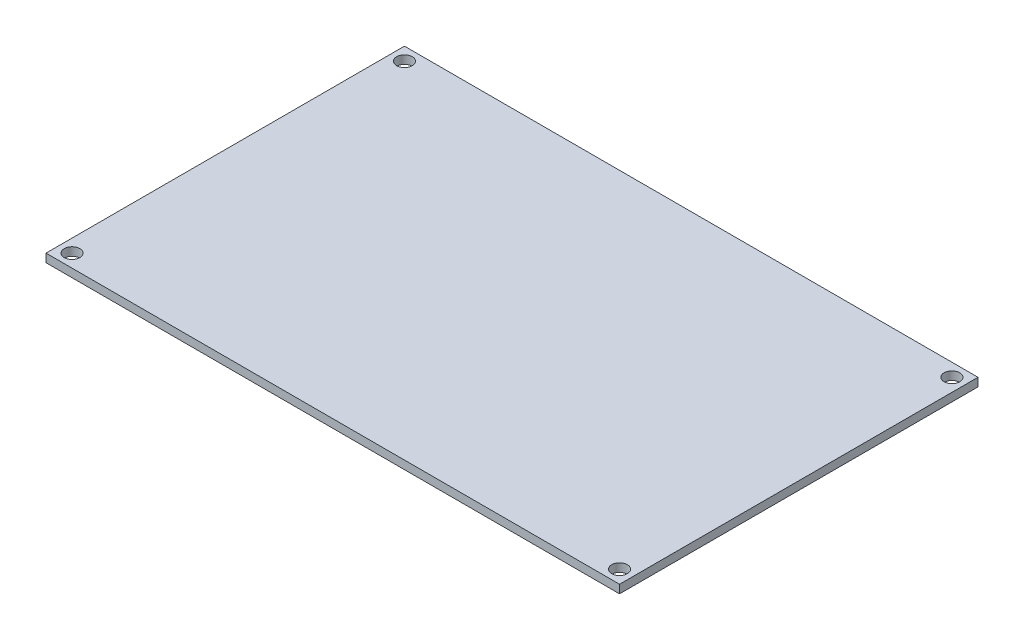
ISO-10303-21;
HEADER;
FILE_DESCRIPTION(('STEP AP214'),'2;1');
FILE_NAME('part.step','',(''),(''),'','','');
FILE_SCHEMA(('AUTOMOTIVE_DESIGN { 1 0 10303 214 1 1 1 1 }'));
ENDSEC;
DATA;
#1=APPLICATION_CONTEXT('core data for automotive mechanical design processes');
#2=APPLICATION_PROTOCOL_DEFINITION('international standard','automotive_design',2000,#1);
#3=PRODUCT_CONTEXT('',#1,'mechanical');
#4=PRODUCT('Part','Part','',(#3));
#5=PRODUCT_RELATED_PRODUCT_CATEGORY('part','',(#4));
#6=PRODUCT_DEFINITION_FORMATION('','',#4);
#7=PRODUCT_DEFINITION_CONTEXT('part definition',#1,'design');
#8=PRODUCT_DEFINITION('design','',#6,#7);
#9=PRODUCT_DEFINITION_SHAPE('','',#8);
#10=(LENGTH_UNIT() NAMED_UNIT(*) SI_UNIT(.MILLI.,.METRE.));
#11=(NAMED_UNIT(*) PLANE_ANGLE_UNIT() SI_UNIT($,.RADIAN.));
#12=(NAMED_UNIT(*) SI_UNIT($,.STERADIAN.) SOLID_ANGLE_UNIT());
#13=UNCERTAINTY_MEASURE_WITH_UNIT(LENGTH_MEASURE(1.E-05),#10,'distance_accuracy_value','');
#14=(GEOMETRIC_REPRESENTATION_CONTEXT(3) GLOBAL_UNCERTAINTY_ASSIGNED_CONTEXT((#13)) GLOBAL_UNIT_ASSIGNED_CONTEXT((#10,
#11,#12)) REPRESENTATION_CONTEXT('',''));
#15=CARTESIAN_POINT('',(0.,0.,0.));
#16=DIRECTION('',(0.,0.,1.));
#17=DIRECTION('',(1.,0.,0.));
#18=AXIS2_PLACEMENT_3D('',#15,#16,#17);
#19=CARTESIAN_POINT('',(0.,1.6,0.));
#20=DIRECTION('',(0.,-1.,0.));
#21=DIRECTION('',(0.,0.,-1.));
#22=AXIS2_PLACEMENT_3D('',#19,#20,#21);
#23=PLANE('',#22);
#24=DIRECTION('',(0.,0.,-1.));
#25=VECTOR('',#24,1.);
#26=CARTESIAN_POINT('',(55.,1.6,34.375));
#27=LINE('',#26,#25);
#28=CARTESIAN_POINT('',(55.,1.6,34.375));
#29=VERTEX_POINT('',#28);
#30=CARTESIAN_POINT('',(55.,1.6,-34.375));
#31=VERTEX_POINT('',#30);
#32=EDGE_CURVE('E85',#29,#31,#27,.T.);
#33=ORIENTED_EDGE('',*,*,#32,.T.);
#34=DIRECTION('',(-1.,0.,0.));
#35=VECTOR('',#34,1.);
#36=CARTESIAN_POINT('',(-55.,1.6,-34.375));
#37=LINE('',#36,#35);
#38=CARTESIAN_POINT('',(-55.,1.6,-34.375));
#39=VERTEX_POINT('',#38);
#40=EDGE_CURVE('E80',#31,#39,#37,.T.);
#41=ORIENTED_EDGE('',*,*,#40,.T.);
#42=DIRECTION('',(0.,0.,1.));
#43=VECTOR('',#42,1.);
#44=CARTESIAN_POINT('',(-55.,1.6,34.375));
#45=LINE('',#44,#43);
#46=CARTESIAN_POINT('',(-55.,1.6,34.375));
#47=VERTEX_POINT('',#46);
#48=EDGE_CURVE('E83',#39,#47,#45,.T.);
#49=ORIENTED_EDGE('',*,*,#48,.T.);
#50=DIRECTION('',(1.,0.,0.));
#51=VECTOR('',#50,1.);
#52=CARTESIAN_POINT('',(-55.,1.6,34.375));
#53=LINE('',#52,#51);
#54=EDGE_CURVE('E50',#47,#29,#53,.T.);
#55=ORIENTED_EDGE('',*,*,#54,.T.);
#56=EDGE_LOOP('',(#33,#41,#49,#55));
#57=FACE_BOUND('',#56,.T.);
#58=CARTESIAN_POINT('',(-52.5,1.6,-31.875));
#59=DIRECTION('',(0.,1.,0.));
#60=DIRECTION('',(0.,0.,1.));
#61=AXIS2_PLACEMENT_3D('',#58,#59,#60);
#62=CIRCLE('',#61,1.5);
#63=CARTESIAN_POINT('',(-52.5,1.6,-30.375));
#64=VERTEX_POINT('',#63);
#65=EDGE_CURVE('E100',#64,#64,#62,.T.);
#66=ORIENTED_EDGE('',*,*,#65,.F.);
#67=EDGE_LOOP('',(#66));
#68=FACE_BOUND('',#67,.T.);
#69=CARTESIAN_POINT('',(-52.5,1.6,31.875));
#70=DIRECTION('',(0.,1.,0.));
#71=DIRECTION('',(0.,0.,-1.));
#72=AXIS2_PLACEMENT_3D('',#69,#70,#71);
#73=CIRCLE('',#72,1.5);
#74=CARTESIAN_POINT('',(-52.5,1.6,30.375));
#75=VERTEX_POINT('',#74);
#76=EDGE_CURVE('E115',#75,#75,#73,.T.);
#77=ORIENTED_EDGE('',*,*,#76,.F.);
#78=EDGE_LOOP('',(#77));
#79=FACE_BOUND('',#78,.T.);
#80=CARTESIAN_POINT('',(52.5,1.6,31.875));
#81=DIRECTION('',(0.,1.,0.));
#82=DIRECTION('',(0.,0.,1.));
#83=AXIS2_PLACEMENT_3D('',#80,#81,#82);
#84=CIRCLE('',#83,1.5);
#85=CARTESIAN_POINT('',(52.5,1.6,33.375));
#86=VERTEX_POINT('',#85);
#87=EDGE_CURVE('E121',#86,#86,#84,.T.);
#88=ORIENTED_EDGE('',*,*,#87,.F.);
#89=EDGE_LOOP('',(#88));
#90=FACE_BOUND('',#89,.T.);
#91=CARTESIAN_POINT('',(52.5,1.6,-31.875));
#92=DIRECTION('',(0.,1.,0.));
#93=DIRECTION('',(0.,0.,-1.));
#94=AXIS2_PLACEMENT_3D('',#91,#92,#93);
#95=CIRCLE('',#94,1.5);
#96=CARTESIAN_POINT('',(52.5,1.6,-33.375));
#97=VERTEX_POINT('',#96);
#98=EDGE_CURVE('E127',#97,#97,#95,.T.);
#99=ORIENTED_EDGE('',*,*,#98,.F.);
#100=EDGE_LOOP('',(#99));
#101=FACE_BOUND('',#100,.T.);
#102=ADVANCED_FACE('F33',(#57,#68,#79,#90,#101),#23,.F.);
#103=CARTESIAN_POINT('',(0.,0.,0.));
#104=DIRECTION('',(0.,-1.,0.));
#105=DIRECTION('',(0.,0.,-1.));
#106=AXIS2_PLACEMENT_3D('',#103,#104,#105);
#107=PLANE('',#106);
#108=CARTESIAN_POINT('',(52.5,0.,31.875));
#109=DIRECTION('',(0.,1.,0.));
#110=DIRECTION('',(0.,0.,1.));
#111=AXIS2_PLACEMENT_3D('',#108,#109,#110);
#112=CIRCLE('',#111,1.5);
#113=CARTESIAN_POINT('',(52.5,0.,33.375));
#114=VERTEX_POINT('',#113);
#115=EDGE_CURVE('E124',#114,#114,#112,.T.);
#116=ORIENTED_EDGE('',*,*,#115,.T.);
#117=EDGE_LOOP('',(#116));
#118=FACE_BOUND('',#117,.T.);
#119=CARTESIAN_POINT('',(-52.5,0.,-31.875));
#120=DIRECTION('',(0.,1.,0.));
#121=DIRECTION('',(0.,0.,1.));
#122=AXIS2_PLACEMENT_3D('',#119,#120,#121);
#123=CIRCLE('',#122,1.5);
#124=CARTESIAN_POINT('',(-52.5,0.,-30.375));
#125=VERTEX_POINT('',#124);
#126=EDGE_CURVE('E112',#125,#125,#123,.T.);
#127=ORIENTED_EDGE('',*,*,#126,.T.);
#128=EDGE_LOOP('',(#127));
#129=FACE_BOUND('',#128,.T.);
#130=DIRECTION('',(0.,0.,-1.));
#131=VECTOR('',#130,1.);
#132=CARTESIAN_POINT('',(55.,0.,34.375));
#133=LINE('',#132,#131);
#134=CARTESIAN_POINT('',(55.,0.,34.375));
#135=VERTEX_POINT('',#134);
#136=CARTESIAN_POINT('',(55.,0.,-34.375));
#137=VERTEX_POINT('',#136);
#138=EDGE_CURVE('E97',#135,#137,#133,.T.);
#139=ORIENTED_EDGE('',*,*,#138,.F.);
#140=DIRECTION('',(1.,0.,0.));
#141=VECTOR('',#140,1.);
#142=CARTESIAN_POINT('',(-55.,0.,34.375));
#143=LINE('',#142,#141);
#144=CARTESIAN_POINT('',(-55.,0.,34.375));
#145=VERTEX_POINT('',#144);
#146=EDGE_CURVE('E73',#145,#135,#143,.T.);
#147=ORIENTED_EDGE('',*,*,#146,.F.);
#148=DIRECTION('',(0.,0.,1.));
#149=VECTOR('',#148,1.);
#150=CARTESIAN_POINT('',(-55.,0.,34.375));
#151=LINE('',#150,#149);
#152=CARTESIAN_POINT('',(-55.,0.,-34.375));
#153=VERTEX_POINT('',#152);
#154=EDGE_CURVE('E67',#153,#145,#151,.T.);
#155=ORIENTED_EDGE('',*,*,#154,.F.);
#156=DIRECTION('',(-1.,0.,0.));
#157=VECTOR('',#156,1.);
#158=CARTESIAN_POINT('',(-55.,0.,-34.375));
#159=LINE('',#158,#157);
#160=EDGE_CURVE('E89',#137,#153,#159,.T.);
#161=ORIENTED_EDGE('',*,*,#160,.F.);
#162=EDGE_LOOP('',(#139,#147,#155,#161));
#163=FACE_BOUND('',#162,.T.);
#164=CARTESIAN_POINT('',(-52.5,0.,31.875));
#165=DIRECTION('',(0.,1.,0.));
#166=DIRECTION('',(0.,0.,-1.));
#167=AXIS2_PLACEMENT_3D('',#164,#165,#166);
#168=CIRCLE('',#167,1.5);
#169=CARTESIAN_POINT('',(-52.5,0.,30.375));
#170=VERTEX_POINT('',#169);
#171=EDGE_CURVE('E118',#170,#170,#168,.T.);
#172=ORIENTED_EDGE('',*,*,#171,.T.);
#173=EDGE_LOOP('',(#172));
#174=FACE_BOUND('',#173,.T.);
#175=CARTESIAN_POINT('',(52.5,0.,-31.875));
#176=DIRECTION('',(0.,1.,0.));
#177=DIRECTION('',(0.,0.,-1.));
#178=AXIS2_PLACEMENT_3D('',#175,#176,#177);
#179=CIRCLE('',#178,1.5);
#180=CARTESIAN_POINT('',(52.5,0.,-33.375));
#181=VERTEX_POINT('',#180);
#182=EDGE_CURVE('E130',#181,#181,#179,.T.);
#183=ORIENTED_EDGE('',*,*,#182,.T.);
#184=EDGE_LOOP('',(#183));
#185=FACE_BOUND('',#184,.T.);
#186=ADVANCED_FACE('F108',(#118,#129,#163,#174,#185),#107,.T.);
#187=CARTESIAN_POINT('',(55.,1.6,34.375));
#188=DIRECTION('',(-1.,0.,0.));
#189=DIRECTION('',(0.,0.,1.));
#190=AXIS2_PLACEMENT_3D('',#187,#188,#189);
#191=PLANE('',#190);
#192=ORIENTED_EDGE('',*,*,#138,.T.);
#193=DIRECTION('',(0.,-1.,0.));
#194=VECTOR('',#193,1.);
#195=CARTESIAN_POINT('',(55.,1.6,-34.375));
#196=LINE('',#195,#194);
#197=EDGE_CURVE('E11',#31,#137,#196,.T.);
#198=ORIENTED_EDGE('',*,*,#197,.F.);
#199=ORIENTED_EDGE('',*,*,#32,.F.);
#200=DIRECTION('',(0.,-1.,0.));
#201=VECTOR('',#200,1.);
#202=CARTESIAN_POINT('',(55.,1.6,34.375));
#203=LINE('',#202,#201);
#204=EDGE_CURVE('E93',#29,#135,#203,.T.);
#205=ORIENTED_EDGE('',*,*,#204,.T.);
#206=EDGE_LOOP('',(#192,#198,#199,#205));
#207=FACE_BOUND('',#206,.T.);
#208=ADVANCED_FACE('F35',(#207),#191,.F.);
#209=CARTESIAN_POINT('',(-55.,1.6,-34.375));
#210=DIRECTION('',(0.,0.,1.));
#211=DIRECTION('',(1.,0.,0.));
#212=AXIS2_PLACEMENT_3D('',#209,#210,#211);
#213=PLANE('',#212);
#214=ORIENTED_EDGE('',*,*,#160,.T.);
#215=DIRECTION('',(0.,-1.,0.));
#216=VECTOR('',#215,1.);
#217=CARTESIAN_POINT('',(-55.,1.6,-34.375));
#218=LINE('',#217,#216);
#219=EDGE_CURVE('E42',#39,#153,#218,.T.);
#220=ORIENTED_EDGE('',*,*,#219,.F.);
#221=ORIENTED_EDGE('',*,*,#40,.F.);
#222=ORIENTED_EDGE('',*,*,#197,.T.);
#223=EDGE_LOOP('',(#214,#220,#221,#222));
#224=FACE_BOUND('',#223,.T.);
#225=ADVANCED_FACE('F88',(#224),#213,.F.);
#226=CARTESIAN_POINT('',(-55.,1.6,34.375));
#227=DIRECTION('',(1.,0.,0.));
#228=DIRECTION('',(0.,0.,-1.));
#229=AXIS2_PLACEMENT_3D('',#226,#227,#228);
#230=PLANE('',#229);
#231=ORIENTED_EDGE('',*,*,#154,.T.);
#232=DIRECTION('',(0.,-1.,0.));
#233=VECTOR('',#232,1.);
#234=CARTESIAN_POINT('',(-55.,1.6,34.375));
#235=LINE('',#234,#233);
#236=EDGE_CURVE('E90',#47,#145,#235,.T.);
#237=ORIENTED_EDGE('',*,*,#236,.F.);
#238=ORIENTED_EDGE('',*,*,#48,.F.);
#239=ORIENTED_EDGE('',*,*,#219,.T.);
#240=EDGE_LOOP('',(#231,#237,#238,#239));
#241=FACE_BOUND('',#240,.T.);
#242=ADVANCED_FACE('F91',(#241),#230,.F.);
#243=CARTESIAN_POINT('',(-55.,1.6,34.375));
#244=DIRECTION('',(0.,0.,-1.));
#245=DIRECTION('',(-1.,0.,0.));
#246=AXIS2_PLACEMENT_3D('',#243,#244,#245);
#247=PLANE('',#246);
#248=ORIENTED_EDGE('',*,*,#146,.T.);
#249=ORIENTED_EDGE('',*,*,#204,.F.);
#250=ORIENTED_EDGE('',*,*,#54,.F.);
#251=ORIENTED_EDGE('',*,*,#236,.T.);
#252=EDGE_LOOP('',(#248,#249,#250,#251));
#253=FACE_BOUND('',#252,.T.);
#254=ADVANCED_FACE('F105',(#253),#247,.F.);
#255=CARTESIAN_POINT('',(-52.5,1.6,-31.875));
#256=DIRECTION('',(0.,-1.,0.));
#257=DIRECTION('',(0.,0.,-1.));
#258=AXIS2_PLACEMENT_3D('',#255,#256,#257);
#259=CYLINDRICAL_SURFACE('',#258,1.5);
#260=ORIENTED_EDGE('',*,*,#65,.T.);
#261=EDGE_LOOP('',(#260));
#262=FACE_BOUND('',#261,.T.);
#263=ORIENTED_EDGE('',*,*,#126,.F.);
#264=EDGE_LOOP('',(#263));
#265=FACE_BOUND('',#264,.T.);
#266=ADVANCED_FACE('F147',(#262,#265),#259,.F.);
#267=CARTESIAN_POINT('',(-52.5,1.6,31.875));
#268=DIRECTION('',(0.,-1.,0.));
#269=DIRECTION('',(0.,0.,-1.));
#270=AXIS2_PLACEMENT_3D('',#267,#268,#269);
#271=CYLINDRICAL_SURFACE('',#270,1.5);
#272=ORIENTED_EDGE('',*,*,#76,.T.);
#273=EDGE_LOOP('',(#272));
#274=FACE_BOUND('',#273,.T.);
#275=ORIENTED_EDGE('',*,*,#171,.F.);
#276=EDGE_LOOP('',(#275));
#277=FACE_BOUND('',#276,.T.);
#278=ADVANCED_FACE('F193',(#274,#277),#271,.F.);
#279=CARTESIAN_POINT('',(52.5,1.6,31.875));
#280=DIRECTION('',(0.,-1.,0.));
#281=DIRECTION('',(0.,0.,-1.));
#282=AXIS2_PLACEMENT_3D('',#279,#280,#281);
#283=CYLINDRICAL_SURFACE('',#282,1.5);
#284=ORIENTED_EDGE('',*,*,#87,.T.);
#285=EDGE_LOOP('',(#284));
#286=FACE_BOUND('',#285,.T.);
#287=ORIENTED_EDGE('',*,*,#115,.F.);
#288=EDGE_LOOP('',(#287));
#289=FACE_BOUND('',#288,.T.);
#290=ADVANCED_FACE('F201',(#286,#289),#283,.F.);
#291=CARTESIAN_POINT('',(52.5,1.6,-31.875));
#292=DIRECTION('',(0.,-1.,0.));
#293=DIRECTION('',(0.,0.,-1.));
#294=AXIS2_PLACEMENT_3D('',#291,#292,#293);
#295=CYLINDRICAL_SURFACE('',#294,1.5);
#296=ORIENTED_EDGE('',*,*,#98,.T.);
#297=EDGE_LOOP('',(#296));
#298=FACE_BOUND('',#297,.T.);
#299=ORIENTED_EDGE('',*,*,#182,.F.);
#300=EDGE_LOOP('',(#299));
#301=FACE_BOUND('',#300,.T.);
#302=ADVANCED_FACE('F136',(#298,#301),#295,.F.);
#303=CLOSED_SHELL('',(#102,#186,#208,#225,#242,#254,#266,#278,#290,#302));
#304=MANIFOLD_SOLID_BREP('B2',#303);
#305=ADVANCED_BREP_SHAPE_REPRESENTATION('',(#18,#304),#14);
#306=SHAPE_DEFINITION_REPRESENTATION(#9,#305);
ENDSEC;
END-ISO-10303-21;
